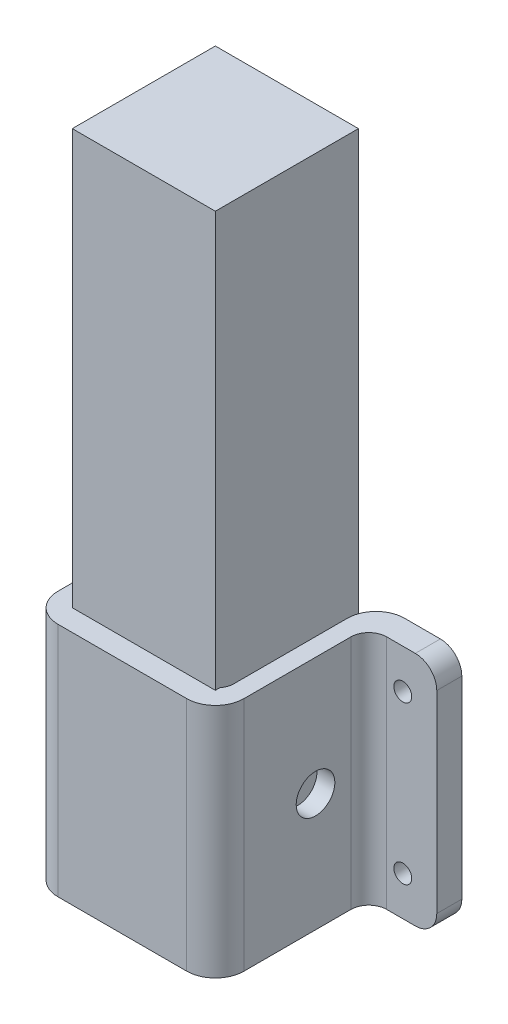
ISO-10303-21;
HEADER;
FILE_DESCRIPTION(('STEP AP214'),'2;1');
FILE_NAME('part.step','',(''),(''),'','','');
FILE_SCHEMA(('AUTOMOTIVE_DESIGN { 1 0 10303 214 1 1 1 1 }'));
ENDSEC;
DATA;
#1=APPLICATION_CONTEXT('core data for automotive mechanical design processes');
#2=APPLICATION_PROTOCOL_DEFINITION('international standard','automotive_design',2000,#1);
#3=PRODUCT_CONTEXT('',#1,'mechanical');
#4=PRODUCT('Part','Part','',(#3));
#5=PRODUCT_RELATED_PRODUCT_CATEGORY('part','',(#4));
#6=PRODUCT_DEFINITION_FORMATION('','',#4);
#7=PRODUCT_DEFINITION_CONTEXT('part definition',#1,'design');
#8=PRODUCT_DEFINITION('design','',#6,#7);
#9=PRODUCT_DEFINITION_SHAPE('','',#8);
#10=(LENGTH_UNIT() NAMED_UNIT(*) SI_UNIT(.MILLI.,.METRE.));
#11=(NAMED_UNIT(*) PLANE_ANGLE_UNIT() SI_UNIT($,.RADIAN.));
#12=(NAMED_UNIT(*) SI_UNIT($,.STERADIAN.) SOLID_ANGLE_UNIT());
#13=UNCERTAINTY_MEASURE_WITH_UNIT(LENGTH_MEASURE(1.E-05),#10,'distance_accuracy_value','');
#14=(GEOMETRIC_REPRESENTATION_CONTEXT(3) GLOBAL_UNCERTAINTY_ASSIGNED_CONTEXT((#13)) GLOBAL_UNIT_ASSIGNED_CONTEXT((#10,
#11,#12)) REPRESENTATION_CONTEXT('',''));
#15=CARTESIAN_POINT('',(0.,0.,0.));
#16=DIRECTION('',(0.,0.,1.));
#17=DIRECTION('',(1.,0.,0.));
#18=AXIS2_PLACEMENT_3D('',#15,#16,#17);
#19=CARTESIAN_POINT('',(0.,0.,-18.45));
#20=DIRECTION('',(0.,0.,1.));
#21=DIRECTION('',(1.,0.,0.));
#22=AXIS2_PLACEMENT_3D('',#19,#20,#21);
#23=PLANE('',#22);
#24=DIRECTION('',(0.,-1.,0.));
#25=VECTOR('',#24,1.);
#26=CARTESIAN_POINT('',(-12.5,33.,-18.45));
#27=LINE('',#26,#25);
#28=CARTESIAN_POINT('',(-12.5,30.,-18.45));
#29=VERTEX_POINT('',#28);
#30=CARTESIAN_POINT('',(-12.5,3.,-18.45));
#31=VERTEX_POINT('',#30);
#32=EDGE_CURVE('E347',#29,#31,#27,.T.);
#33=ORIENTED_EDGE('',*,*,#32,.T.);
#34=CARTESIAN_POINT('',(-9.5,3.,-18.45));
#35=DIRECTION('',(0.,0.,1.));
#36=DIRECTION('',(1.,0.,0.));
#37=AXIS2_PLACEMENT_3D('',#34,#35,#36);
#38=CIRCLE('',#37,3.);
#39=CARTESIAN_POINT('',(-9.5,0.,-18.45));
#40=VERTEX_POINT('',#39);
#41=EDGE_CURVE('E12',#31,#40,#38,.T.);
#42=ORIENTED_EDGE('',*,*,#41,.T.);
#43=DIRECTION('',(1.,0.,0.));
#44=VECTOR('',#43,1.);
#45=CARTESIAN_POINT('',(-12.5,0.,-18.45));
#46=LINE('',#45,#44);
#47=CARTESIAN_POINT('',(-5.5,0.,-18.45));
#48=VERTEX_POINT('',#47);
#49=EDGE_CURVE('E369',#40,#48,#46,.T.);
#50=ORIENTED_EDGE('',*,*,#49,.T.);
#51=DIRECTION('',(0.,-1.,0.));
#52=VECTOR('',#51,1.);
#53=CARTESIAN_POINT('',(-5.5,0.,-18.45));
#54=LINE('',#53,#52);
#55=CARTESIAN_POINT('',(-5.5,33.,-18.45));
#56=VERTEX_POINT('',#55);
#57=EDGE_CURVE('E236',#48,#56,#54,.F.);
#58=ORIENTED_EDGE('',*,*,#57,.T.);
#59=DIRECTION('',(-1.,0.,0.));
#60=VECTOR('',#59,1.);
#61=CARTESIAN_POINT('',(-0.5,33.,-18.45));
#62=LINE('',#61,#60);
#63=CARTESIAN_POINT('',(-9.5,33.,-18.45));
#64=VERTEX_POINT('',#63);
#65=EDGE_CURVE('E227',#56,#64,#62,.T.);
#66=ORIENTED_EDGE('',*,*,#65,.T.);
#67=CARTESIAN_POINT('',(-9.5,30.,-18.45));
#68=DIRECTION('',(0.,0.,1.));
#69=DIRECTION('',(1.,0.,0.));
#70=AXIS2_PLACEMENT_3D('',#67,#68,#69);
#71=CIRCLE('',#70,3.);
#72=EDGE_CURVE('E57',#64,#29,#71,.T.);
#73=ORIENTED_EDGE('',*,*,#72,.T.);
#74=EDGE_LOOP('',(#33,#42,#50,#58,#66,#73));
#75=FACE_BOUND('',#74,.T.);
#76=CARTESIAN_POINT('',(-7.74999999999999,5.5,-18.45));
#77=DIRECTION('',(0.,0.,-1.));
#78=DIRECTION('',(-1.,0.,0.));
#79=AXIS2_PLACEMENT_3D('',#76,#77,#78);
#80=CIRCLE('',#79,1.25);
#81=CARTESIAN_POINT('',(-8.99999999999999,5.5,-18.45));
#82=VERTEX_POINT('',#81);
#83=EDGE_CURVE('E782',#82,#82,#80,.F.);
#84=ORIENTED_EDGE('',*,*,#83,.F.);
#85=EDGE_LOOP('',(#84));
#86=FACE_BOUND('',#85,.T.);
#87=CARTESIAN_POINT('',(-7.75,27.5,-18.45));
#88=DIRECTION('',(0.,0.,-1.));
#89=DIRECTION('',(-1.,0.,0.));
#90=AXIS2_PLACEMENT_3D('',#87,#88,#89);
#91=CIRCLE('',#90,1.25);
#92=CARTESIAN_POINT('',(-9.,27.5,-18.45));
#93=VERTEX_POINT('',#92);
#94=EDGE_CURVE('E772',#93,#93,#91,.T.);
#95=ORIENTED_EDGE('',*,*,#94,.T.);
#96=EDGE_LOOP('',(#95));
#97=FACE_BOUND('',#96,.T.);
#98=ADVANCED_FACE('F49',(#75,#86,#97),#23,.T.);
#99=CARTESIAN_POINT('',(0.,0.,-21.95));
#100=DIRECTION('',(0.,0.,1.));
#101=DIRECTION('',(1.,0.,0.));
#102=AXIS2_PLACEMENT_3D('',#99,#100,#101);
#103=PLANE('',#102);
#104=CARTESIAN_POINT('',(-7.74999999999999,5.5,-21.95));
#105=DIRECTION('',(0.,0.,1.));
#106=DIRECTION('',(1.,0.,0.));
#107=AXIS2_PLACEMENT_3D('',#104,#105,#106);
#108=CIRCLE('',#107,1.25);
#109=CARTESIAN_POINT('',(-6.49999999999999,5.5,-21.95));
#110=VERTEX_POINT('',#109);
#111=EDGE_CURVE('E779',#110,#110,#108,.F.);
#112=ORIENTED_EDGE('',*,*,#111,.F.);
#113=EDGE_LOOP('',(#112));
#114=FACE_BOUND('',#113,.T.);
#115=DIRECTION('',(1.,0.,0.));
#116=VECTOR('',#115,1.);
#117=CARTESIAN_POINT('',(-12.5,0.,-21.95));
#118=LINE('',#117,#116);
#119=CARTESIAN_POINT('',(-9.5,0.,-21.95));
#120=VERTEX_POINT('',#119);
#121=CARTESIAN_POINT('',(-4.5,0.,-21.95));
#122=VERTEX_POINT('',#121);
#123=EDGE_CURVE('E355',#120,#122,#118,.T.);
#124=ORIENTED_EDGE('',*,*,#123,.F.);
#125=CARTESIAN_POINT('',(-9.5,3.,-21.95));
#126=DIRECTION('',(0.,0.,1.));
#127=DIRECTION('',(1.,0.,0.));
#128=AXIS2_PLACEMENT_3D('',#125,#126,#127);
#129=CIRCLE('',#128,3.);
#130=CARTESIAN_POINT('',(-12.5,3.,-21.95));
#131=VERTEX_POINT('',#130);
#132=EDGE_CURVE('E338',#120,#131,#129,.F.);
#133=ORIENTED_EDGE('',*,*,#132,.T.);
#134=DIRECTION('',(0.,-1.,0.));
#135=VECTOR('',#134,1.);
#136=CARTESIAN_POINT('',(-12.5,33.,-21.95));
#137=LINE('',#136,#135);
#138=CARTESIAN_POINT('',(-12.5,30.,-21.95));
#139=VERTEX_POINT('',#138);
#140=EDGE_CURVE('E346',#139,#131,#137,.T.);
#141=ORIENTED_EDGE('',*,*,#140,.F.);
#142=CARTESIAN_POINT('',(-9.5,30.,-21.95));
#143=DIRECTION('',(0.,0.,1.));
#144=DIRECTION('',(1.,0.,0.));
#145=AXIS2_PLACEMENT_3D('',#142,#143,#144);
#146=CIRCLE('',#145,3.);
#147=CARTESIAN_POINT('',(-9.5,33.,-21.95));
#148=VERTEX_POINT('',#147);
#149=EDGE_CURVE('E336',#139,#148,#146,.F.);
#150=ORIENTED_EDGE('',*,*,#149,.T.);
#151=DIRECTION('',(-1.,0.,0.));
#152=VECTOR('',#151,1.);
#153=CARTESIAN_POINT('',(-0.5,33.,-21.95));
#154=LINE('',#153,#152);
#155=CARTESIAN_POINT('',(-4.5,33.,-21.95));
#156=VERTEX_POINT('',#155);
#157=EDGE_CURVE('E358',#156,#148,#154,.T.);
#158=ORIENTED_EDGE('',*,*,#157,.F.);
#159=DIRECTION('',(0.,1.,0.));
#160=VECTOR('',#159,1.);
#161=CARTESIAN_POINT('',(-4.5,0.,-21.95));
#162=LINE('',#161,#160);
#163=EDGE_CURVE('E310',#156,#122,#162,.F.);
#164=ORIENTED_EDGE('',*,*,#163,.T.);
#165=EDGE_LOOP('',(#124,#133,#141,#150,#158,#164));
#166=FACE_BOUND('',#165,.T.);
#167=CARTESIAN_POINT('',(-7.75,27.5,-21.95));
#168=DIRECTION('',(0.,0.,1.));
#169=DIRECTION('',(1.,0.,0.));
#170=AXIS2_PLACEMENT_3D('',#167,#168,#169);
#171=CIRCLE('',#170,1.25);
#172=CARTESIAN_POINT('',(-6.5,27.5,-21.95));
#173=VERTEX_POINT('',#172);
#174=EDGE_CURVE('E774',#173,#173,#171,.T.);
#175=ORIENTED_EDGE('',*,*,#174,.T.);
#176=EDGE_LOOP('',(#175));
#177=FACE_BOUND('',#176,.T.);
#178=ADVANCED_FACE('F351',(#114,#166,#177),#103,.F.);
#179=CARTESIAN_POINT('',(0.,0.,-18.45));
#180=DIRECTION('',(0.,0.,-1.));
#181=DIRECTION('',(-1.,0.,0.));
#182=AXIS2_PLACEMENT_3D('',#179,#180,#181);
#183=PLANE('',#182);
#184=DIRECTION('',(1.,0.,0.));
#185=VECTOR('',#184,1.);
#186=CARTESIAN_POINT('',(32.5,0.,-18.45));
#187=LINE('',#186,#185);
#188=CARTESIAN_POINT('',(25.5,0.,-18.45));
#189=VERTEX_POINT('',#188);
#190=CARTESIAN_POINT('',(29.5,0.,-18.45));
#191=VERTEX_POINT('',#190);
#192=EDGE_CURVE('E380',#189,#191,#187,.T.);
#193=ORIENTED_EDGE('',*,*,#192,.T.);
#194=CARTESIAN_POINT('',(29.5,3.,-18.45));
#195=DIRECTION('',(0.,0.,-1.));
#196=DIRECTION('',(-1.,0.,0.));
#197=AXIS2_PLACEMENT_3D('',#194,#195,#196);
#198=CIRCLE('',#197,3.);
#199=CARTESIAN_POINT('',(32.5,3.,-18.45));
#200=VERTEX_POINT('',#199);
#201=EDGE_CURVE('E329',#191,#200,#198,.F.);
#202=ORIENTED_EDGE('',*,*,#201,.T.);
#203=DIRECTION('',(0.,1.,0.));
#204=VECTOR('',#203,1.);
#205=CARTESIAN_POINT('',(32.5,33.,-18.45));
#206=LINE('',#205,#204);
#207=CARTESIAN_POINT('',(32.5,30.,-18.45));
#208=VERTEX_POINT('',#207);
#209=EDGE_CURVE('E383',#200,#208,#206,.T.);
#210=ORIENTED_EDGE('',*,*,#209,.T.);
#211=CARTESIAN_POINT('',(29.5,30.,-18.45));
#212=DIRECTION('',(0.,0.,-1.));
#213=DIRECTION('',(-1.,0.,0.));
#214=AXIS2_PLACEMENT_3D('',#211,#212,#213);
#215=CIRCLE('',#214,3.);
#216=CARTESIAN_POINT('',(29.5,33.,-18.45));
#217=VERTEX_POINT('',#216);
#218=EDGE_CURVE('E327',#208,#217,#215,.F.);
#219=ORIENTED_EDGE('',*,*,#218,.T.);
#220=DIRECTION('',(-1.,0.,0.));
#221=VECTOR('',#220,1.);
#222=CARTESIAN_POINT('',(20.5,33.,-18.45));
#223=LINE('',#222,#221);
#224=CARTESIAN_POINT('',(25.5,33.,-18.45));
#225=VERTEX_POINT('',#224);
#226=EDGE_CURVE('E386',#217,#225,#223,.T.);
#227=ORIENTED_EDGE('',*,*,#226,.T.);
#228=DIRECTION('',(0.,1.,0.));
#229=VECTOR('',#228,1.);
#230=CARTESIAN_POINT('',(25.5,0.,-18.45));
#231=LINE('',#230,#229);
#232=EDGE_CURVE('E246',#225,#189,#231,.F.);
#233=ORIENTED_EDGE('',*,*,#232,.T.);
#234=EDGE_LOOP('',(#193,#202,#210,#219,#227,#233));
#235=FACE_BOUND('',#234,.T.);
#236=CARTESIAN_POINT('',(27.75,5.50000000000001,-18.45));
#237=DIRECTION('',(0.,0.,1.));
#238=DIRECTION('',(1.,0.,0.));
#239=AXIS2_PLACEMENT_3D('',#236,#237,#238);
#240=CIRCLE('',#239,1.25);
#241=CARTESIAN_POINT('',(29.,5.50000000000001,-18.45));
#242=VERTEX_POINT('',#241);
#243=EDGE_CURVE('E771',#242,#242,#240,.F.);
#244=ORIENTED_EDGE('',*,*,#243,.T.);
#245=EDGE_LOOP('',(#244));
#246=FACE_BOUND('',#245,.T.);
#247=CARTESIAN_POINT('',(27.75,27.5,-18.45));
#248=DIRECTION('',(0.,0.,1.));
#249=DIRECTION('',(1.,0.,0.));
#250=AXIS2_PLACEMENT_3D('',#247,#248,#249);
#251=CIRCLE('',#250,1.25);
#252=CARTESIAN_POINT('',(29.,27.5,-18.45));
#253=VERTEX_POINT('',#252);
#254=EDGE_CURVE('E356',#253,#253,#251,.T.);
#255=ORIENTED_EDGE('',*,*,#254,.F.);
#256=EDGE_LOOP('',(#255));
#257=FACE_BOUND('',#256,.T.);
#258=ADVANCED_FACE('F432',(#235,#246,#257),#183,.F.);
#259=CARTESIAN_POINT('',(0.,0.,-21.95));
#260=DIRECTION('',(0.,0.,-1.));
#261=DIRECTION('',(-1.,0.,0.));
#262=AXIS2_PLACEMENT_3D('',#259,#260,#261);
#263=PLANE('',#262);
#264=CARTESIAN_POINT('',(27.75,5.50000000000001,-21.95));
#265=DIRECTION('',(0.,0.,-1.));
#266=DIRECTION('',(-1.,0.,0.));
#267=AXIS2_PLACEMENT_3D('',#264,#265,#266);
#268=CIRCLE('',#267,1.25);
#269=CARTESIAN_POINT('',(26.5,5.50000000000001,-21.95));
#270=VERTEX_POINT('',#269);
#271=EDGE_CURVE('E364',#270,#270,#268,.T.);
#272=ORIENTED_EDGE('',*,*,#271,.F.);
#273=EDGE_LOOP('',(#272));
#274=FACE_BOUND('',#273,.T.);
#275=DIRECTION('',(0.,1.,0.));
#276=VECTOR('',#275,1.);
#277=CARTESIAN_POINT('',(32.5,33.,-21.95));
#278=LINE('',#277,#276);
#279=CARTESIAN_POINT('',(32.5,3.,-21.95));
#280=VERTEX_POINT('',#279);
#281=CARTESIAN_POINT('',(32.5,30.,-21.95));
#282=VERTEX_POINT('',#281);
#283=EDGE_CURVE('E375',#280,#282,#278,.T.);
#284=ORIENTED_EDGE('',*,*,#283,.F.);
#285=CARTESIAN_POINT('',(29.5,3.,-21.95));
#286=DIRECTION('',(0.,0.,-1.));
#287=DIRECTION('',(-1.,0.,0.));
#288=AXIS2_PLACEMENT_3D('',#285,#286,#287);
#289=CIRCLE('',#288,3.);
#290=CARTESIAN_POINT('',(29.5,0.,-21.95));
#291=VERTEX_POINT('',#290);
#292=EDGE_CURVE('E320',#280,#291,#289,.T.);
#293=ORIENTED_EDGE('',*,*,#292,.T.);
#294=DIRECTION('',(1.,0.,0.));
#295=VECTOR('',#294,1.);
#296=CARTESIAN_POINT('',(32.5,0.,-21.95));
#297=LINE('',#296,#295);
#298=CARTESIAN_POINT('',(24.5,0.,-21.95));
#299=VERTEX_POINT('',#298);
#300=EDGE_CURVE('E372',#299,#291,#297,.T.);
#301=ORIENTED_EDGE('',*,*,#300,.F.);
#302=DIRECTION('',(0.,-1.,0.));
#303=VECTOR('',#302,1.);
#304=CARTESIAN_POINT('',(24.5,0.,-21.95));
#305=LINE('',#304,#303);
#306=CARTESIAN_POINT('',(24.5,33.,-21.95));
#307=VERTEX_POINT('',#306);
#308=EDGE_CURVE('E300',#299,#307,#305,.F.);
#309=ORIENTED_EDGE('',*,*,#308,.T.);
#310=DIRECTION('',(-1.,0.,0.));
#311=VECTOR('',#310,1.);
#312=CARTESIAN_POINT('',(20.5,33.,-21.95));
#313=LINE('',#312,#311);
#314=CARTESIAN_POINT('',(29.5,33.,-21.95));
#315=VERTEX_POINT('',#314);
#316=EDGE_CURVE('E378',#315,#307,#313,.T.);
#317=ORIENTED_EDGE('',*,*,#316,.F.);
#318=CARTESIAN_POINT('',(29.5,30.,-21.95));
#319=DIRECTION('',(0.,0.,-1.));
#320=DIRECTION('',(-1.,0.,0.));
#321=AXIS2_PLACEMENT_3D('',#318,#319,#320);
#322=CIRCLE('',#321,3.);
#323=EDGE_CURVE('E318',#315,#282,#322,.T.);
#324=ORIENTED_EDGE('',*,*,#323,.T.);
#325=EDGE_LOOP('',(#284,#293,#301,#309,#317,#324));
#326=FACE_BOUND('',#325,.T.);
#327=CARTESIAN_POINT('',(27.75,27.5,-21.95));
#328=DIRECTION('',(0.,0.,-1.));
#329=DIRECTION('',(-1.,0.,0.));
#330=AXIS2_PLACEMENT_3D('',#327,#328,#329);
#331=CIRCLE('',#330,1.25);
#332=CARTESIAN_POINT('',(26.5,27.5,-21.95));
#333=VERTEX_POINT('',#332);
#334=EDGE_CURVE('E361',#333,#333,#331,.F.);
#335=ORIENTED_EDGE('',*,*,#334,.T.);
#336=EDGE_LOOP('',(#335));
#337=FACE_BOUND('',#336,.T.);
#338=ADVANCED_FACE('F423',(#274,#326,#337),#263,.T.);
#339=CARTESIAN_POINT('',(23.,33.,3.));
#340=DIRECTION('',(1.,0.,0.));
#341=DIRECTION('',(0.,1.,0.));
#342=AXIS2_PLACEMENT_3D('',#339,#340,#341);
#343=PLANE('',#342);
#344=CARTESIAN_POINT('',(23.,16.5,-11.));
#345=DIRECTION('',(-1.,0.,0.));
#346=DIRECTION('',(0.,-1.,0.));
#347=AXIS2_PLACEMENT_3D('',#344,#345,#346);
#348=CIRCLE('',#347,2.7);
#349=CARTESIAN_POINT('',(23.,13.8,-11.));
#350=VERTEX_POINT('',#349);
#351=EDGE_CURVE('E796',#350,#350,#348,.T.);
#352=ORIENTED_EDGE('',*,*,#351,.T.);
#353=EDGE_LOOP('',(#352));
#354=FACE_BOUND('',#353,.T.);
#355=DIRECTION('',(0.,0.,-1.));
#356=VECTOR('',#355,1.);
#357=CARTESIAN_POINT('',(23.,33.,3.));
#358=LINE('',#357,#356);
#359=CARTESIAN_POINT('',(23.,33.,-1.));
#360=VERTEX_POINT('',#359);
#361=CARTESIAN_POINT('',(23.,33.,-15.95));
#362=VERTEX_POINT('',#361);
#363=EDGE_CURVE('E241',#360,#362,#358,.T.);
#364=ORIENTED_EDGE('',*,*,#363,.F.);
#365=DIRECTION('',(0.,-1.,0.));
#366=VECTOR('',#365,1.);
#367=CARTESIAN_POINT('',(23.,0.,-1.));
#368=LINE('',#367,#366);
#369=CARTESIAN_POINT('',(23.,0.,-1.));
#370=VERTEX_POINT('',#369);
#371=EDGE_CURVE('E268',#360,#370,#368,.T.);
#372=ORIENTED_EDGE('',*,*,#371,.T.);
#373=DIRECTION('',(0.,0.,-1.));
#374=VECTOR('',#373,1.);
#375=CARTESIAN_POINT('',(23.,0.,3.));
#376=LINE('',#375,#374);
#377=CARTESIAN_POINT('',(23.,0.,-15.95));
#378=VERTEX_POINT('',#377);
#379=EDGE_CURVE('E408',#370,#378,#376,.T.);
#380=ORIENTED_EDGE('',*,*,#379,.T.);
#381=DIRECTION('',(0.,1.,0.));
#382=VECTOR('',#381,1.);
#383=CARTESIAN_POINT('',(23.,33.,-15.95));
#384=LINE('',#383,#382);
#385=EDGE_CURVE('E238',#378,#362,#384,.T.);
#386=ORIENTED_EDGE('',*,*,#385,.T.);
#387=EDGE_LOOP('',(#364,#372,#380,#386));
#388=FACE_BOUND('',#387,.T.);
#389=ADVANCED_FACE('F420',(#354,#388),#343,.T.);
#390=CARTESIAN_POINT('',(0.,0.,0.));
#391=DIRECTION('',(0.,0.,-1.));
#392=DIRECTION('',(-1.,0.,0.));
#393=AXIS2_PLACEMENT_3D('',#390,#391,#392);
#394=PLANE('',#393);
#395=DIRECTION('',(1.,0.,0.));
#396=VECTOR('',#395,1.);
#397=CARTESIAN_POINT('',(-3.,33.,0.));
#398=LINE('',#397,#396);
#399=CARTESIAN_POINT('',(1.5,33.,0.));
#400=VERTEX_POINT('',#399);
#401=CARTESIAN_POINT('',(18.5,33.,0.));
#402=VERTEX_POINT('',#401);
#403=EDGE_CURVE('E395',#400,#402,#398,.T.);
#404=ORIENTED_EDGE('',*,*,#403,.T.);
#405=DIRECTION('',(0.,-1.,0.));
#406=VECTOR('',#405,1.);
#407=CARTESIAN_POINT('',(18.5,0.,0.));
#408=LINE('',#407,#406);
#409=CARTESIAN_POINT('',(18.5,0.,0.));
#410=VERTEX_POINT('',#409);
#411=EDGE_CURVE('E274',#402,#410,#408,.T.);
#412=ORIENTED_EDGE('',*,*,#411,.T.);
#413=DIRECTION('',(-1.,0.,0.));
#414=VECTOR('',#413,1.);
#415=CARTESIAN_POINT('',(23.,0.,0.));
#416=LINE('',#415,#414);
#417=CARTESIAN_POINT('',(1.5,0.,0.));
#418=VERTEX_POINT('',#417);
#419=EDGE_CURVE('E401',#410,#418,#416,.T.);
#420=ORIENTED_EDGE('',*,*,#419,.T.);
#421=DIRECTION('',(0.,1.,0.));
#422=VECTOR('',#421,1.);
#423=CARTESIAN_POINT('',(1.5,33.,0.));
#424=LINE('',#423,#422);
#425=EDGE_CURVE('E271',#418,#400,#424,.T.);
#426=ORIENTED_EDGE('',*,*,#425,.T.);
#427=EDGE_LOOP('',(#404,#412,#420,#426));
#428=FACE_BOUND('',#427,.T.);
#429=ADVANCED_FACE('F422',(#428),#394,.T.);
#430=CARTESIAN_POINT('',(-3.,33.,3.));
#431=DIRECTION('',(0.,1.,0.));
#432=DIRECTION('',(0.,0.,1.));
#433=AXIS2_PLACEMENT_3D('',#430,#431,#432);
#434=PLANE('',#433);
#435=ORIENTED_EDGE('',*,*,#226,.F.);
#436=DIRECTION('',(0.,0.,-1.));
#437=VECTOR('',#436,1.);
#438=CARTESIAN_POINT('',(29.5,33.,-21.95));
#439=LINE('',#438,#437);
#440=EDGE_CURVE('E333',#217,#315,#439,.T.);
#441=ORIENTED_EDGE('',*,*,#440,.T.);
#442=ORIENTED_EDGE('',*,*,#316,.T.);
#443=CARTESIAN_POINT('',(24.5,33.,-17.95));
#444=DIRECTION('',(0.,1.,0.));
#445=DIRECTION('',(0.,0.,1.));
#446=AXIS2_PLACEMENT_3D('',#443,#444,#445);
#447=CIRCLE('',#446,4.);
#448=CARTESIAN_POINT('',(20.5,33.,-17.95));
#449=VERTEX_POINT('',#448);
#450=EDGE_CURVE('E305',#307,#449,#447,.T.);
#451=ORIENTED_EDGE('',*,*,#450,.T.);
#452=DIRECTION('',(0.,0.,1.));
#453=VECTOR('',#452,1.);
#454=CARTESIAN_POINT('',(20.5,33.,-20.2));
#455=LINE('',#454,#453);
#456=CARTESIAN_POINT('',(20.5,33.,-2.));
#457=VERTEX_POINT('',#456);
#458=EDGE_CURVE('E391',#449,#457,#455,.T.);
#459=ORIENTED_EDGE('',*,*,#458,.T.);
#460=CARTESIAN_POINT('',(18.5,33.,-2.));
#461=DIRECTION('',(0.,1.,0.));
#462=DIRECTION('',(0.,0.,1.));
#463=AXIS2_PLACEMENT_3D('',#460,#461,#462);
#464=CIRCLE('',#463,2.);
#465=EDGE_CURVE('E286',#457,#402,#464,.F.);
#466=ORIENTED_EDGE('',*,*,#465,.T.);
#467=ORIENTED_EDGE('',*,*,#403,.F.);
#468=CARTESIAN_POINT('',(1.5,33.,-2.));
#469=DIRECTION('',(0.,1.,0.));
#470=DIRECTION('',(0.,0.,1.));
#471=AXIS2_PLACEMENT_3D('',#468,#469,#470);
#472=CIRCLE('',#471,2.);
#473=CARTESIAN_POINT('',(-0.5,33.,-2.));
#474=VERTEX_POINT('',#473);
#475=EDGE_CURVE('E288',#400,#474,#472,.F.);
#476=ORIENTED_EDGE('',*,*,#475,.T.);
#477=DIRECTION('',(0.,0.,1.));
#478=VECTOR('',#477,1.);
#479=CARTESIAN_POINT('',(-0.5,33.,-20.2));
#480=LINE('',#479,#478);
#481=CARTESIAN_POINT('',(-0.5,33.,-17.95));
#482=VERTEX_POINT('',#481);
#483=EDGE_CURVE('E389',#482,#474,#480,.T.);
#484=ORIENTED_EDGE('',*,*,#483,.F.);
#485=CARTESIAN_POINT('',(-4.5,33.,-17.95));
#486=DIRECTION('',(0.,1.,0.));
#487=DIRECTION('',(0.,0.,1.));
#488=AXIS2_PLACEMENT_3D('',#485,#486,#487);
#489=CIRCLE('',#488,4.);
#490=EDGE_CURVE('E303',#482,#156,#489,.T.);
#491=ORIENTED_EDGE('',*,*,#490,.T.);
#492=ORIENTED_EDGE('',*,*,#157,.T.);
#493=DIRECTION('',(0.,0.,-1.));
#494=VECTOR('',#493,1.);
#495=CARTESIAN_POINT('',(-9.5,33.,-18.45));
#496=LINE('',#495,#494);
#497=EDGE_CURVE('E331',#148,#64,#496,.F.);
#498=ORIENTED_EDGE('',*,*,#497,.T.);
#499=ORIENTED_EDGE('',*,*,#65,.F.);
#500=CARTESIAN_POINT('',(-5.5,33.,-15.95));
#501=DIRECTION('',(0.,1.,0.));
#502=DIRECTION('',(0.,0.,1.));
#503=AXIS2_PLACEMENT_3D('',#500,#501,#502);
#504=CIRCLE('',#503,2.5);
#505=CARTESIAN_POINT('',(-3.,33.,-15.95));
#506=VERTEX_POINT('',#505);
#507=EDGE_CURVE('E224',#56,#506,#504,.F.);
#508=ORIENTED_EDGE('',*,*,#507,.T.);
#509=DIRECTION('',(0.,0.,-1.));
#510=VECTOR('',#509,1.);
#511=CARTESIAN_POINT('',(-3.,33.,3.));
#512=LINE('',#511,#510);
#513=CARTESIAN_POINT('',(-3.,33.,-1.));
#514=VERTEX_POINT('',#513);
#515=EDGE_CURVE('E210',#514,#506,#512,.T.);
#516=ORIENTED_EDGE('',*,*,#515,.F.);
#517=CARTESIAN_POINT('',(1.,33.,-1.));
#518=DIRECTION('',(0.,1.,0.));
#519=DIRECTION('',(0.,0.,1.));
#520=AXIS2_PLACEMENT_3D('',#517,#518,#519);
#521=CIRCLE('',#520,4.);
#522=CARTESIAN_POINT('',(0.999999999999999,33.,3.));
#523=VERTEX_POINT('',#522);
#524=EDGE_CURVE('E266',#514,#523,#521,.T.);
#525=ORIENTED_EDGE('',*,*,#524,.T.);
#526=DIRECTION('',(1.,0.,0.));
#527=VECTOR('',#526,1.);
#528=CARTESIAN_POINT('',(-3.,33.,3.));
#529=LINE('',#528,#527);
#530=CARTESIAN_POINT('',(19.,33.,3.));
#531=VERTEX_POINT('',#530);
#532=EDGE_CURVE('E397',#523,#531,#529,.T.);
#533=ORIENTED_EDGE('',*,*,#532,.T.);
#534=CARTESIAN_POINT('',(19.,33.,-1.));
#535=DIRECTION('',(0.,1.,0.));
#536=DIRECTION('',(0.,0.,1.));
#537=AXIS2_PLACEMENT_3D('',#534,#535,#536);
#538=CIRCLE('',#537,4.);
#539=EDGE_CURVE('E264',#531,#360,#538,.T.);
#540=ORIENTED_EDGE('',*,*,#539,.T.);
#541=ORIENTED_EDGE('',*,*,#363,.T.);
#542=CARTESIAN_POINT('',(25.5,33.,-15.95));
#543=DIRECTION('',(0.,1.,0.));
#544=DIRECTION('',(0.,0.,1.));
#545=AXIS2_PLACEMENT_3D('',#542,#543,#544);
#546=CIRCLE('',#545,2.5);
#547=EDGE_CURVE('E230',#362,#225,#546,.F.);
#548=ORIENTED_EDGE('',*,*,#547,.T.);
#549=EDGE_LOOP('',(#435,#441,#442,#451,#459,#466,#467,#476,#484,#491,#492,#498,#499,#508,#516,
#525,#533,#540,#541,#548));
#550=FACE_BOUND('',#549,.T.);
#551=ADVANCED_FACE('F226',(#550),#434,.T.);
#552=CARTESIAN_POINT('',(-3.,33.,3.));
#553=DIRECTION('',(1.,0.,0.));
#554=DIRECTION('',(0.,1.,0.));
#555=AXIS2_PLACEMENT_3D('',#552,#553,#554);
#556=PLANE('',#555);
#557=CARTESIAN_POINT('',(-3.,16.5,-11.));
#558=DIRECTION('',(-1.,0.,0.));
#559=DIRECTION('',(0.,-1.,0.));
#560=AXIS2_PLACEMENT_3D('',#557,#558,#559);
#561=CIRCLE('',#560,2.7);
#562=CARTESIAN_POINT('',(-3.,13.8,-11.));
#563=VERTEX_POINT('',#562);
#564=EDGE_CURVE('E785',#563,#563,#561,.T.);
#565=ORIENTED_EDGE('',*,*,#564,.F.);
#566=EDGE_LOOP('',(#565));
#567=FACE_BOUND('',#566,.T.);
#568=DIRECTION('',(0.,0.,-1.));
#569=VECTOR('',#568,1.);
#570=CARTESIAN_POINT('',(-3.,0.,3.));
#571=LINE('',#570,#569);
#572=CARTESIAN_POINT('',(-3.,0.,-1.));
#573=VERTEX_POINT('',#572);
#574=CARTESIAN_POINT('',(-3.,0.,-15.95));
#575=VERTEX_POINT('',#574);
#576=EDGE_CURVE('E220',#573,#575,#571,.T.);
#577=ORIENTED_EDGE('',*,*,#576,.F.);
#578=DIRECTION('',(0.,-1.,0.));
#579=VECTOR('',#578,1.);
#580=CARTESIAN_POINT('',(-3.,33.,-1.));
#581=LINE('',#580,#579);
#582=EDGE_CURVE('E217',#573,#514,#581,.F.);
#583=ORIENTED_EDGE('',*,*,#582,.T.);
#584=ORIENTED_EDGE('',*,*,#515,.T.);
#585=DIRECTION('',(0.,-1.,0.));
#586=VECTOR('',#585,1.);
#587=CARTESIAN_POINT('',(-3.,33.,-15.95));
#588=LINE('',#587,#586);
#589=EDGE_CURVE('E215',#506,#575,#588,.T.);
#590=ORIENTED_EDGE('',*,*,#589,.T.);
#591=EDGE_LOOP('',(#577,#583,#584,#590));
#592=FACE_BOUND('',#591,.T.);
#593=ADVANCED_FACE('F213',(#567,#592),#556,.F.);
#594=CARTESIAN_POINT('',(23.,0.,3.));
#595=DIRECTION('',(0.,-1.,0.));
#596=DIRECTION('',(0.,0.,-1.));
#597=AXIS2_PLACEMENT_3D('',#594,#595,#596);
#598=PLANE('',#597);
#599=ORIENTED_EDGE('',*,*,#300,.T.);
#600=DIRECTION('',(0.,0.,-1.));
#601=VECTOR('',#600,1.);
#602=CARTESIAN_POINT('',(29.5,0.,-18.45));
#603=LINE('',#602,#601);
#604=EDGE_CURVE('E325',#291,#191,#603,.F.);
#605=ORIENTED_EDGE('',*,*,#604,.T.);
#606=ORIENTED_EDGE('',*,*,#192,.F.);
#607=CARTESIAN_POINT('',(25.5,0.,-15.95));
#608=DIRECTION('',(0.,-1.,0.));
#609=DIRECTION('',(0.,0.,-1.));
#610=AXIS2_PLACEMENT_3D('',#607,#608,#609);
#611=CIRCLE('',#610,2.5);
#612=EDGE_CURVE('E251',#189,#378,#611,.F.);
#613=ORIENTED_EDGE('',*,*,#612,.T.);
#614=ORIENTED_EDGE('',*,*,#379,.F.);
#615=CARTESIAN_POINT('',(19.,0.,-1.));
#616=DIRECTION('',(0.,-1.,0.));
#617=DIRECTION('',(0.,0.,-1.));
#618=AXIS2_PLACEMENT_3D('',#615,#616,#617);
#619=CIRCLE('',#618,4.);
#620=CARTESIAN_POINT('',(19.,0.,3.));
#621=VERTEX_POINT('',#620);
#622=EDGE_CURVE('E259',#370,#621,#619,.T.);
#623=ORIENTED_EDGE('',*,*,#622,.T.);
#624=DIRECTION('',(-1.,0.,0.));
#625=VECTOR('',#624,1.);
#626=CARTESIAN_POINT('',(23.,0.,3.));
#627=LINE('',#626,#625);
#628=CARTESIAN_POINT('',(0.999999999999997,0.,3.));
#629=VERTEX_POINT('',#628);
#630=EDGE_CURVE('E400',#621,#629,#627,.T.);
#631=ORIENTED_EDGE('',*,*,#630,.T.);
#632=CARTESIAN_POINT('',(0.999999999999997,0.,-1.));
#633=DIRECTION('',(0.,-1.,0.));
#634=DIRECTION('',(0.,0.,-1.));
#635=AXIS2_PLACEMENT_3D('',#632,#633,#634);
#636=CIRCLE('',#635,4.);
#637=EDGE_CURVE('E261',#629,#573,#636,.T.);
#638=ORIENTED_EDGE('',*,*,#637,.T.);
#639=ORIENTED_EDGE('',*,*,#576,.T.);
#640=CARTESIAN_POINT('',(-5.5,0.,-15.95));
#641=DIRECTION('',(0.,-1.,0.));
#642=DIRECTION('',(0.,0.,-1.));
#643=AXIS2_PLACEMENT_3D('',#640,#641,#642);
#644=CIRCLE('',#643,2.5);
#645=EDGE_CURVE('E231',#575,#48,#644,.F.);
#646=ORIENTED_EDGE('',*,*,#645,.T.);
#647=ORIENTED_EDGE('',*,*,#49,.F.);
#648=DIRECTION('',(0.,0.,-1.));
#649=VECTOR('',#648,1.);
#650=CARTESIAN_POINT('',(-9.5,0.,-21.95));
#651=LINE('',#650,#649);
#652=EDGE_CURVE('E322',#40,#120,#651,.T.);
#653=ORIENTED_EDGE('',*,*,#652,.T.);
#654=ORIENTED_EDGE('',*,*,#123,.T.);
#655=CARTESIAN_POINT('',(-4.5,0.,-17.95));
#656=DIRECTION('',(0.,-1.,0.));
#657=DIRECTION('',(0.,0.,-1.));
#658=AXIS2_PLACEMENT_3D('',#655,#656,#657);
#659=CIRCLE('',#658,4.);
#660=CARTESIAN_POINT('',(-0.5,0.,-17.95));
#661=VERTEX_POINT('',#660);
#662=EDGE_CURVE('E296',#122,#661,#659,.T.);
#663=ORIENTED_EDGE('',*,*,#662,.T.);
#664=DIRECTION('',(0.,0.,1.));
#665=VECTOR('',#664,1.);
#666=CARTESIAN_POINT('',(-0.5,0.,-20.2));
#667=LINE('',#666,#665);
#668=CARTESIAN_POINT('',(-0.5,0.,-2.));
#669=VERTEX_POINT('',#668);
#670=EDGE_CURVE('E388',#661,#669,#667,.T.);
#671=ORIENTED_EDGE('',*,*,#670,.T.);
#672=CARTESIAN_POINT('',(1.5,0.,-2.));
#673=DIRECTION('',(0.,-1.,0.));
#674=DIRECTION('',(0.,0.,-1.));
#675=AXIS2_PLACEMENT_3D('',#672,#673,#674);
#676=CIRCLE('',#675,2.);
#677=EDGE_CURVE('E291',#669,#418,#676,.F.);
#678=ORIENTED_EDGE('',*,*,#677,.T.);
#679=ORIENTED_EDGE('',*,*,#419,.F.);
#680=CARTESIAN_POINT('',(18.5,0.,-2.));
#681=DIRECTION('',(0.,-1.,0.));
#682=DIRECTION('',(0.,0.,-1.));
#683=AXIS2_PLACEMENT_3D('',#680,#681,#682);
#684=CIRCLE('',#683,2.);
#685=CARTESIAN_POINT('',(20.5,0.,-2.));
#686=VERTEX_POINT('',#685);
#687=EDGE_CURVE('E283',#410,#686,#684,.F.);
#688=ORIENTED_EDGE('',*,*,#687,.T.);
#689=DIRECTION('',(0.,0.,1.));
#690=VECTOR('',#689,1.);
#691=CARTESIAN_POINT('',(20.5,0.,-20.2));
#692=LINE('',#691,#690);
#693=CARTESIAN_POINT('',(20.5,0.,-17.95));
#694=VERTEX_POINT('',#693);
#695=EDGE_CURVE('E393',#694,#686,#692,.T.);
#696=ORIENTED_EDGE('',*,*,#695,.F.);
#697=CARTESIAN_POINT('',(24.5,0.,-17.95));
#698=DIRECTION('',(0.,-1.,0.));
#699=DIRECTION('',(0.,0.,-1.));
#700=AXIS2_PLACEMENT_3D('',#697,#698,#699);
#701=CIRCLE('',#700,4.);
#702=EDGE_CURVE('E298',#694,#299,#701,.T.);
#703=ORIENTED_EDGE('',*,*,#702,.T.);
#704=EDGE_LOOP('',(#599,#605,#606,#613,#614,#623,#631,#638,#639,#646,#647,#653,#654,#663,#671,
#678,#679,#688,#696,#703));
#705=FACE_BOUND('',#704,.T.);
#706=ADVANCED_FACE('F468',(#705),#598,.T.);
#707=CARTESIAN_POINT('',(0.,0.,3.));
#708=DIRECTION('',(0.,0.,-1.));
#709=DIRECTION('',(-1.,0.,0.));
#710=AXIS2_PLACEMENT_3D('',#707,#708,#709);
#711=PLANE('',#710);
#712=ORIENTED_EDGE('',*,*,#532,.F.);
#713=DIRECTION('',(0.,-1.,0.));
#714=VECTOR('',#713,1.);
#715=CARTESIAN_POINT('',(0.999999999999997,0.,3.));
#716=LINE('',#715,#714);
#717=EDGE_CURVE('E256',#523,#629,#716,.T.);
#718=ORIENTED_EDGE('',*,*,#717,.T.);
#719=ORIENTED_EDGE('',*,*,#630,.F.);
#720=DIRECTION('',(0.,-1.,0.));
#721=VECTOR('',#720,1.);
#722=CARTESIAN_POINT('',(19.,33.,3.));
#723=LINE('',#722,#721);
#724=EDGE_CURVE('E254',#621,#531,#723,.F.);
#725=ORIENTED_EDGE('',*,*,#724,.T.);
#726=EDGE_LOOP('',(#712,#718,#719,#725));
#727=FACE_BOUND('',#726,.T.);
#728=ADVANCED_FACE('F465',(#727),#711,.F.);
#729=CARTESIAN_POINT('',(20.5,33.,-20.2));
#730=DIRECTION('',(-1.,0.,0.));
#731=DIRECTION('',(0.,0.,1.));
#732=AXIS2_PLACEMENT_3D('',#729,#730,#731);
#733=PLANE('',#732);
#734=CARTESIAN_POINT('',(20.5,16.5,-11.));
#735=DIRECTION('',(-1.,0.,0.));
#736=DIRECTION('',(0.,0.,1.));
#737=AXIS2_PLACEMENT_3D('',#734,#735,#736);
#738=CIRCLE('',#737,2.7);
#739=CARTESIAN_POINT('',(20.5,16.5,-8.3));
#740=VERTEX_POINT('',#739);
#741=EDGE_CURVE('E791',#740,#740,#738,.T.);
#742=ORIENTED_EDGE('',*,*,#741,.F.);
#743=EDGE_LOOP('',(#742));
#744=FACE_BOUND('',#743,.T.);
#745=ORIENTED_EDGE('',*,*,#458,.F.);
#746=DIRECTION('',(0.,-1.,0.));
#747=VECTOR('',#746,1.);
#748=CARTESIAN_POINT('',(20.5,33.,-17.95));
#749=LINE('',#748,#747);
#750=EDGE_CURVE('E293',#449,#694,#749,.T.);
#751=ORIENTED_EDGE('',*,*,#750,.T.);
#752=ORIENTED_EDGE('',*,*,#695,.T.);
#753=DIRECTION('',(0.,-1.,0.));
#754=VECTOR('',#753,1.);
#755=CARTESIAN_POINT('',(20.5,33.,-2.));
#756=LINE('',#755,#754);
#757=EDGE_CURVE('E277',#686,#457,#756,.F.);
#758=ORIENTED_EDGE('',*,*,#757,.T.);
#759=EDGE_LOOP('',(#745,#751,#752,#758));
#760=FACE_BOUND('',#759,.T.);
#761=ADVANCED_FACE('F461',(#744,#760),#733,.T.);
#762=CARTESIAN_POINT('',(-0.5,33.,-20.2));
#763=DIRECTION('',(1.,0.,0.));
#764=DIRECTION('',(0.,0.,-1.));
#765=AXIS2_PLACEMENT_3D('',#762,#763,#764);
#766=PLANE('',#765);
#767=CARTESIAN_POINT('',(-0.5,16.5,-11.));
#768=DIRECTION('',(1.,0.,0.));
#769=DIRECTION('',(0.,0.,-1.));
#770=AXIS2_PLACEMENT_3D('',#767,#768,#769);
#771=CIRCLE('',#770,2.7);
#772=CARTESIAN_POINT('',(-0.5,16.5,-13.7));
#773=VERTEX_POINT('',#772);
#774=EDGE_CURVE('E788',#773,#773,#771,.F.);
#775=ORIENTED_EDGE('',*,*,#774,.T.);
#776=EDGE_LOOP('',(#775));
#777=FACE_BOUND('',#776,.T.);
#778=ORIENTED_EDGE('',*,*,#670,.F.);
#779=DIRECTION('',(0.,1.,0.));
#780=VECTOR('',#779,1.);
#781=CARTESIAN_POINT('',(-0.5,33.,-17.95));
#782=LINE('',#781,#780);
#783=EDGE_CURVE('E307',#661,#482,#782,.T.);
#784=ORIENTED_EDGE('',*,*,#783,.T.);
#785=ORIENTED_EDGE('',*,*,#483,.T.);
#786=DIRECTION('',(0.,1.,0.));
#787=VECTOR('',#786,1.);
#788=CARTESIAN_POINT('',(-0.5,0.,-2.));
#789=LINE('',#788,#787);
#790=EDGE_CURVE('E280',#474,#669,#789,.F.);
#791=ORIENTED_EDGE('',*,*,#790,.T.);
#792=EDGE_LOOP('',(#778,#784,#785,#791));
#793=FACE_BOUND('',#792,.T.);
#794=ADVANCED_FACE('F457',(#777,#793),#766,.T.);
#795=CARTESIAN_POINT('',(32.5,33.,-18.45));
#796=DIRECTION('',(-1.,0.,0.));
#797=DIRECTION('',(0.,0.,1.));
#798=AXIS2_PLACEMENT_3D('',#795,#796,#797);
#799=PLANE('',#798);
#800=ORIENTED_EDGE('',*,*,#209,.F.);
#801=DIRECTION('',(0.,0.,-1.));
#802=VECTOR('',#801,1.);
#803=CARTESIAN_POINT('',(32.5,3.,-21.95));
#804=LINE('',#803,#802);
#805=EDGE_CURVE('E315',#200,#280,#804,.T.);
#806=ORIENTED_EDGE('',*,*,#805,.T.);
#807=ORIENTED_EDGE('',*,*,#283,.T.);
#808=DIRECTION('',(0.,0.,-1.));
#809=VECTOR('',#808,1.);
#810=CARTESIAN_POINT('',(32.5,30.,-18.45));
#811=LINE('',#810,#809);
#812=EDGE_CURVE('E313',#282,#208,#811,.F.);
#813=ORIENTED_EDGE('',*,*,#812,.T.);
#814=EDGE_LOOP('',(#800,#806,#807,#813));
#815=FACE_BOUND('',#814,.T.);
#816=ADVANCED_FACE('F450',(#815),#799,.F.);
#817=CARTESIAN_POINT('',(-12.5,33.,-18.45));
#818=DIRECTION('',(1.,0.,0.));
#819=DIRECTION('',(0.,0.,-1.));
#820=AXIS2_PLACEMENT_3D('',#817,#818,#819);
#821=PLANE('',#820);
#822=ORIENTED_EDGE('',*,*,#140,.T.);
#823=DIRECTION('',(0.,0.,-1.));
#824=VECTOR('',#823,1.);
#825=CARTESIAN_POINT('',(-12.5,3.,-18.45));
#826=LINE('',#825,#824);
#827=EDGE_CURVE('E64',#131,#31,#826,.F.);
#828=ORIENTED_EDGE('',*,*,#827,.T.);
#829=ORIENTED_EDGE('',*,*,#32,.F.);
#830=DIRECTION('',(0.,0.,-1.));
#831=VECTOR('',#830,1.);
#832=CARTESIAN_POINT('',(-12.5,30.,-21.95));
#833=LINE('',#832,#831);
#834=EDGE_CURVE('E340',#29,#139,#833,.T.);
#835=ORIENTED_EDGE('',*,*,#834,.T.);
#836=EDGE_LOOP('',(#822,#828,#829,#835));
#837=FACE_BOUND('',#836,.T.);
#838=ADVANCED_FACE('F345',(#837),#821,.F.);
#839=CARTESIAN_POINT('',(27.75,5.50000000000001,-21.951));
#840=DIRECTION('',(0.,0.,1.));
#841=DIRECTION('',(1.,0.,0.));
#842=AXIS2_PLACEMENT_3D('',#839,#840,#841);
#843=CYLINDRICAL_SURFACE('',#842,1.25);
#844=ORIENTED_EDGE('',*,*,#271,.T.);
#845=EDGE_LOOP('',(#844));
#846=FACE_BOUND('',#845,.T.);
#847=ORIENTED_EDGE('',*,*,#243,.F.);
#848=EDGE_LOOP('',(#847));
#849=FACE_BOUND('',#848,.T.);
#850=ADVANCED_FACE('F449',(#846,#849),#843,.F.);
#851=CARTESIAN_POINT('',(27.75,27.5,-21.951));
#852=DIRECTION('',(0.,0.,1.));
#853=DIRECTION('',(1.,0.,0.));
#854=AXIS2_PLACEMENT_3D('',#851,#852,#853);
#855=CYLINDRICAL_SURFACE('',#854,1.25);
#856=ORIENTED_EDGE('',*,*,#334,.F.);
#857=EDGE_LOOP('',(#856));
#858=FACE_BOUND('',#857,.T.);
#859=ORIENTED_EDGE('',*,*,#254,.T.);
#860=EDGE_LOOP('',(#859));
#861=FACE_BOUND('',#860,.T.);
#862=ADVANCED_FACE('F747',(#858,#861),#855,.F.);
#863=CARTESIAN_POINT('',(-7.74999999999999,5.5,-21.951));
#864=DIRECTION('',(0.,0.,1.));
#865=DIRECTION('',(1.,0.,0.));
#866=AXIS2_PLACEMENT_3D('',#863,#864,#865);
#867=CYLINDRICAL_SURFACE('',#866,1.25);
#868=ORIENTED_EDGE('',*,*,#83,.T.);
#869=EDGE_LOOP('',(#868));
#870=FACE_BOUND('',#869,.T.);
#871=ORIENTED_EDGE('',*,*,#111,.T.);
#872=EDGE_LOOP('',(#871));
#873=FACE_BOUND('',#872,.T.);
#874=ADVANCED_FACE('F739',(#870,#873),#867,.F.);
#875=CARTESIAN_POINT('',(-7.75,27.5,-21.951));
#876=DIRECTION('',(0.,0.,1.));
#877=DIRECTION('',(1.,0.,0.));
#878=AXIS2_PLACEMENT_3D('',#875,#876,#877);
#879=CYLINDRICAL_SURFACE('',#878,1.25);
#880=ORIENTED_EDGE('',*,*,#94,.F.);
#881=EDGE_LOOP('',(#880));
#882=FACE_BOUND('',#881,.T.);
#883=ORIENTED_EDGE('',*,*,#174,.F.);
#884=EDGE_LOOP('',(#883));
#885=FACE_BOUND('',#884,.T.);
#886=ADVANCED_FACE('F559',(#882,#885),#879,.F.);
#887=CARTESIAN_POINT('',(-5.5,33.,-15.95));
#888=DIRECTION('',(0.,-1.,0.));
#889=DIRECTION('',(1.,0.,0.));
#890=AXIS2_PLACEMENT_3D('',#887,#888,#889);
#891=CYLINDRICAL_SURFACE('',#890,2.5);
#892=ORIENTED_EDGE('',*,*,#507,.F.);
#893=ORIENTED_EDGE('',*,*,#57,.F.);
#894=ORIENTED_EDGE('',*,*,#645,.F.);
#895=ORIENTED_EDGE('',*,*,#589,.F.);
#896=EDGE_LOOP('',(#892,#893,#894,#895));
#897=FACE_BOUND('',#896,.T.);
#898=ADVANCED_FACE('F234',(#897),#891,.F.);
#899=CARTESIAN_POINT('',(25.5,33.,-15.95));
#900=DIRECTION('',(0.,1.,0.));
#901=DIRECTION('',(-1.,0.,0.));
#902=AXIS2_PLACEMENT_3D('',#899,#900,#901);
#903=CYLINDRICAL_SURFACE('',#902,2.5);
#904=ORIENTED_EDGE('',*,*,#612,.F.);
#905=ORIENTED_EDGE('',*,*,#232,.F.);
#906=ORIENTED_EDGE('',*,*,#547,.F.);
#907=ORIENTED_EDGE('',*,*,#385,.F.);
#908=EDGE_LOOP('',(#904,#905,#906,#907));
#909=FACE_BOUND('',#908,.T.);
#910=ADVANCED_FACE('F419',(#909),#903,.F.);
#911=CARTESIAN_POINT('',(0.999999999999997,0.,-1.));
#912=DIRECTION('',(0.,-1.,0.));
#913=DIRECTION('',(1.,0.,0.));
#914=AXIS2_PLACEMENT_3D('',#911,#912,#913);
#915=CYLINDRICAL_SURFACE('',#914,4.);
#916=ORIENTED_EDGE('',*,*,#524,.F.);
#917=ORIENTED_EDGE('',*,*,#582,.F.);
#918=ORIENTED_EDGE('',*,*,#637,.F.);
#919=ORIENTED_EDGE('',*,*,#717,.F.);
#920=EDGE_LOOP('',(#916,#917,#918,#919));
#921=FACE_BOUND('',#920,.T.);
#922=ADVANCED_FACE('F551',(#921),#915,.T.);
#923=CARTESIAN_POINT('',(19.,33.,-1.));
#924=DIRECTION('',(0.,1.,0.));
#925=DIRECTION('',(-1.,0.,0.));
#926=AXIS2_PLACEMENT_3D('',#923,#924,#925);
#927=CYLINDRICAL_SURFACE('',#926,4.);
#928=ORIENTED_EDGE('',*,*,#539,.F.);
#929=ORIENTED_EDGE('',*,*,#724,.F.);
#930=ORIENTED_EDGE('',*,*,#622,.F.);
#931=ORIENTED_EDGE('',*,*,#371,.F.);
#932=EDGE_LOOP('',(#928,#929,#930,#931));
#933=FACE_BOUND('',#932,.T.);
#934=ADVANCED_FACE('F548',(#933),#927,.T.);
#935=CARTESIAN_POINT('',(18.5,0.,-2.));
#936=DIRECTION('',(0.,1.,0.));
#937=DIRECTION('',(0.,0.,1.));
#938=AXIS2_PLACEMENT_3D('',#935,#936,#937);
#939=CYLINDRICAL_SURFACE('',#938,2.);
#940=ORIENTED_EDGE('',*,*,#465,.F.);
#941=ORIENTED_EDGE('',*,*,#757,.F.);
#942=ORIENTED_EDGE('',*,*,#687,.F.);
#943=ORIENTED_EDGE('',*,*,#411,.F.);
#944=EDGE_LOOP('',(#940,#941,#942,#943));
#945=FACE_BOUND('',#944,.T.);
#946=ADVANCED_FACE('F507',(#945),#939,.F.);
#947=CARTESIAN_POINT('',(1.5,0.,-2.));
#948=DIRECTION('',(0.,-1.,0.));
#949=DIRECTION('',(0.,0.,-1.));
#950=AXIS2_PLACEMENT_3D('',#947,#948,#949);
#951=CYLINDRICAL_SURFACE('',#950,2.);
#952=ORIENTED_EDGE('',*,*,#677,.F.);
#953=ORIENTED_EDGE('',*,*,#790,.F.);
#954=ORIENTED_EDGE('',*,*,#475,.F.);
#955=ORIENTED_EDGE('',*,*,#425,.F.);
#956=EDGE_LOOP('',(#952,#953,#954,#955));
#957=FACE_BOUND('',#956,.T.);
#958=ADVANCED_FACE('F513',(#957),#951,.F.);
#959=CARTESIAN_POINT('',(24.5,33.,-17.95));
#960=DIRECTION('',(0.,-1.,0.));
#961=DIRECTION('',(0.,0.,-1.));
#962=AXIS2_PLACEMENT_3D('',#959,#960,#961);
#963=CYLINDRICAL_SURFACE('',#962,4.);
#964=ORIENTED_EDGE('',*,*,#450,.F.);
#965=ORIENTED_EDGE('',*,*,#308,.F.);
#966=ORIENTED_EDGE('',*,*,#702,.F.);
#967=ORIENTED_EDGE('',*,*,#750,.F.);
#968=EDGE_LOOP('',(#964,#965,#966,#967));
#969=FACE_BOUND('',#968,.T.);
#970=ADVANCED_FACE('F500',(#969),#963,.T.);
#971=CARTESIAN_POINT('',(-4.5,33.,-17.95));
#972=DIRECTION('',(0.,-1.,0.));
#973=DIRECTION('',(0.,0.,-1.));
#974=AXIS2_PLACEMENT_3D('',#971,#972,#973);
#975=CYLINDRICAL_SURFACE('',#974,4.);
#976=ORIENTED_EDGE('',*,*,#662,.F.);
#977=ORIENTED_EDGE('',*,*,#163,.F.);
#978=ORIENTED_EDGE('',*,*,#490,.F.);
#979=ORIENTED_EDGE('',*,*,#783,.F.);
#980=EDGE_LOOP('',(#976,#977,#978,#979));
#981=FACE_BOUND('',#980,.T.);
#982=ADVANCED_FACE('F521',(#981),#975,.T.);
#983=CARTESIAN_POINT('',(32.501,16.5,-11.));
#984=DIRECTION('',(-1.,0.,0.));
#985=DIRECTION('',(0.,-1.,0.));
#986=AXIS2_PLACEMENT_3D('',#983,#984,#985);
#987=CYLINDRICAL_SURFACE('',#986,2.7);
#988=ORIENTED_EDGE('',*,*,#774,.F.);
#989=EDGE_LOOP('',(#988));
#990=FACE_BOUND('',#989,.T.);
#991=ORIENTED_EDGE('',*,*,#564,.T.);
#992=EDGE_LOOP('',(#991));
#993=FACE_BOUND('',#992,.T.);
#994=ADVANCED_FACE('F541',(#990,#993),#987,.F.);
#995=CARTESIAN_POINT('',(-12.501,16.5,-11.));
#996=DIRECTION('',(1.,0.,0.));
#997=DIRECTION('',(0.,1.,0.));
#998=AXIS2_PLACEMENT_3D('',#995,#996,#997);
#999=CYLINDRICAL_SURFACE('',#998,2.7);
#1000=ORIENTED_EDGE('',*,*,#741,.T.);
#1001=EDGE_LOOP('',(#1000));
#1002=FACE_BOUND('',#1001,.T.);
#1003=ORIENTED_EDGE('',*,*,#351,.F.);
#1004=EDGE_LOOP('',(#1003));
#1005=FACE_BOUND('',#1004,.T.);
#1006=ADVANCED_FACE('F538',(#1002,#1005),#999,.F.);
#1007=CARTESIAN_POINT('',(29.5,3.,-18.45));
#1008=DIRECTION('',(0.,0.,1.));
#1009=DIRECTION('',(1.,0.,0.));
#1010=AXIS2_PLACEMENT_3D('',#1007,#1008,#1009);
#1011=CYLINDRICAL_SURFACE('',#1010,3.);
#1012=ORIENTED_EDGE('',*,*,#201,.F.);
#1013=ORIENTED_EDGE('',*,*,#604,.F.);
#1014=ORIENTED_EDGE('',*,*,#292,.F.);
#1015=ORIENTED_EDGE('',*,*,#805,.F.);
#1016=EDGE_LOOP('',(#1012,#1013,#1014,#1015));
#1017=FACE_BOUND('',#1016,.T.);
#1018=ADVANCED_FACE('F485',(#1017),#1011,.T.);
#1019=CARTESIAN_POINT('',(29.5,30.,3.));
#1020=DIRECTION('',(0.,0.,1.));
#1021=DIRECTION('',(1.,0.,0.));
#1022=AXIS2_PLACEMENT_3D('',#1019,#1020,#1021);
#1023=CYLINDRICAL_SURFACE('',#1022,3.);
#1024=ORIENTED_EDGE('',*,*,#218,.F.);
#1025=ORIENTED_EDGE('',*,*,#812,.F.);
#1026=ORIENTED_EDGE('',*,*,#323,.F.);
#1027=ORIENTED_EDGE('',*,*,#440,.F.);
#1028=EDGE_LOOP('',(#1024,#1025,#1026,#1027));
#1029=FACE_BOUND('',#1028,.T.);
#1030=ADVANCED_FACE('F493',(#1029),#1023,.T.);
#1031=CARTESIAN_POINT('',(-9.5,3.,3.));
#1032=DIRECTION('',(0.,0.,1.));
#1033=DIRECTION('',(1.,0.,0.));
#1034=AXIS2_PLACEMENT_3D('',#1031,#1032,#1033);
#1035=CYLINDRICAL_SURFACE('',#1034,3.);
#1036=ORIENTED_EDGE('',*,*,#41,.F.);
#1037=ORIENTED_EDGE('',*,*,#827,.F.);
#1038=ORIENTED_EDGE('',*,*,#132,.F.);
#1039=ORIENTED_EDGE('',*,*,#652,.F.);
#1040=EDGE_LOOP('',(#1036,#1037,#1038,#1039));
#1041=FACE_BOUND('',#1040,.T.);
#1042=ADVANCED_FACE('F525',(#1041),#1035,.T.);
#1043=CARTESIAN_POINT('',(-9.5,30.,-18.45));
#1044=DIRECTION('',(0.,0.,1.));
#1045=DIRECTION('',(1.,0.,0.));
#1046=AXIS2_PLACEMENT_3D('',#1043,#1044,#1045);
#1047=CYLINDRICAL_SURFACE('',#1046,3.);
#1048=ORIENTED_EDGE('',*,*,#72,.F.);
#1049=ORIENTED_EDGE('',*,*,#497,.F.);
#1050=ORIENTED_EDGE('',*,*,#149,.F.);
#1051=ORIENTED_EDGE('',*,*,#834,.F.);
#1052=EDGE_LOOP('',(#1048,#1049,#1050,#1051));
#1053=FACE_BOUND('',#1052,.T.);
#1054=ADVANCED_FACE('F51',(#1053),#1047,.T.);
#1055=CLOSED_SHELL('',(#98,#178,#258,#338,#389,#429,#551,#593,#706,#728,#761,#794,#816,#838,
#850,#862,#874,#886,#898,#910,#922,#934,#946,#958,#970,#982,#994,#1006,#1018,#1030,#1042,#1054));
#1056=MANIFOLD_SOLID_BREP('B2',#1055);
#1057=CARTESIAN_POINT('',(0.,0.,-20.));
#1058=DIRECTION('',(-1.,0.,0.));
#1059=DIRECTION('',(0.,0.,1.));
#1060=AXIS2_PLACEMENT_3D('',#1057,#1058,#1059);
#1061=PLANE('',#1060);
#1062=DIRECTION('',(0.,-1.,0.));
#1063=VECTOR('',#1062,1.);
#1064=CARTESIAN_POINT('',(0.,0.,0.));
#1065=LINE('',#1064,#1063);
#1066=CARTESIAN_POINT('',(0.,91.,0.));
#1067=VERTEX_POINT('',#1066);
#1068=CARTESIAN_POINT('',(0.,0.,0.));
#1069=VERTEX_POINT('',#1068);
#1070=EDGE_CURVE('E918',#1067,#1069,#1065,.T.);
#1071=ORIENTED_EDGE('',*,*,#1070,.F.);
#1072=DIRECTION('',(0.,0.,1.));
#1073=VECTOR('',#1072,1.);
#1074=CARTESIAN_POINT('',(0.,91.,-20.));
#1075=LINE('',#1074,#1073);
#1076=CARTESIAN_POINT('',(0.,91.,-20.));
#1077=VERTEX_POINT('',#1076);
#1078=EDGE_CURVE('E47',#1077,#1067,#1075,.T.);
#1079=ORIENTED_EDGE('',*,*,#1078,.F.);
#1080=DIRECTION('',(0.,-1.,0.));
#1081=VECTOR('',#1080,1.);
#1082=CARTESIAN_POINT('',(0.,0.,-20.));
#1083=LINE('',#1082,#1081);
#1084=CARTESIAN_POINT('',(0.,0.,-20.));
#1085=VERTEX_POINT('',#1084);
#1086=EDGE_CURVE('E912',#1077,#1085,#1083,.T.);
#1087=ORIENTED_EDGE('',*,*,#1086,.T.);
#1088=DIRECTION('',(0.,0.,1.));
#1089=VECTOR('',#1088,1.);
#1090=CARTESIAN_POINT('',(0.,0.,-20.));
#1091=LINE('',#1090,#1089);
#1092=EDGE_CURVE('E857',#1085,#1069,#1091,.T.);
#1093=ORIENTED_EDGE('',*,*,#1092,.T.);
#1094=EDGE_LOOP('',(#1071,#1079,#1087,#1093));
#1095=FACE_BOUND('',#1094,.T.);
#1096=ADVANCED_FACE('F854',(#1095),#1061,.T.);
#1097=CARTESIAN_POINT('',(0.,91.,-20.));
#1098=DIRECTION('',(0.,1.,0.));
#1099=DIRECTION('',(0.,0.,1.));
#1100=AXIS2_PLACEMENT_3D('',#1097,#1098,#1099);
#1101=PLANE('',#1100);
#1102=DIRECTION('',(-1.,0.,0.));
#1103=VECTOR('',#1102,1.);
#1104=CARTESIAN_POINT('',(0.,91.,0.));
#1105=LINE('',#1104,#1103);
#1106=CARTESIAN_POINT('',(20.,91.,0.));
#1107=VERTEX_POINT('',#1106);
#1108=EDGE_CURVE('E914',#1107,#1067,#1105,.T.);
#1109=ORIENTED_EDGE('',*,*,#1108,.F.);
#1110=DIRECTION('',(0.,0.,1.));
#1111=VECTOR('',#1110,1.);
#1112=CARTESIAN_POINT('',(20.,91.,-20.));
#1113=LINE('',#1112,#1111);
#1114=CARTESIAN_POINT('',(20.,91.,-20.));
#1115=VERTEX_POINT('',#1114);
#1116=EDGE_CURVE('E863',#1115,#1107,#1113,.T.);
#1117=ORIENTED_EDGE('',*,*,#1116,.F.);
#1118=DIRECTION('',(-1.,0.,0.));
#1119=VECTOR('',#1118,1.);
#1120=CARTESIAN_POINT('',(0.,91.,-20.));
#1121=LINE('',#1120,#1119);
#1122=EDGE_CURVE('E909',#1115,#1077,#1121,.T.);
#1123=ORIENTED_EDGE('',*,*,#1122,.T.);
#1124=ORIENTED_EDGE('',*,*,#1078,.T.);
#1125=EDGE_LOOP('',(#1109,#1117,#1123,#1124));
#1126=FACE_BOUND('',#1125,.T.);
#1127=ADVANCED_FACE('F928',(#1126),#1101,.T.);
#1128=CARTESIAN_POINT('',(20.,0.,-20.));
#1129=DIRECTION('',(1.,0.,0.));
#1130=DIRECTION('',(0.,0.,-1.));
#1131=AXIS2_PLACEMENT_3D('',#1128,#1129,#1130);
#1132=PLANE('',#1131);
#1133=DIRECTION('',(0.,1.,0.));
#1134=VECTOR('',#1133,1.);
#1135=CARTESIAN_POINT('',(20.,0.,0.));
#1136=LINE('',#1135,#1134);
#1137=CARTESIAN_POINT('',(20.,0.,0.));
#1138=VERTEX_POINT('',#1137);
#1139=EDGE_CURVE('E904',#1138,#1107,#1136,.T.);
#1140=ORIENTED_EDGE('',*,*,#1139,.F.);
#1141=DIRECTION('',(0.,0.,1.));
#1142=VECTOR('',#1141,1.);
#1143=CARTESIAN_POINT('',(20.,0.,-20.));
#1144=LINE('',#1143,#1142);
#1145=CARTESIAN_POINT('',(20.,0.,-20.));
#1146=VERTEX_POINT('',#1145);
#1147=EDGE_CURVE('E899',#1146,#1138,#1144,.T.);
#1148=ORIENTED_EDGE('',*,*,#1147,.F.);
#1149=DIRECTION('',(0.,1.,0.));
#1150=VECTOR('',#1149,1.);
#1151=CARTESIAN_POINT('',(20.,0.,-20.));
#1152=LINE('',#1151,#1150);
#1153=EDGE_CURVE('E902',#1146,#1115,#1152,.T.);
#1154=ORIENTED_EDGE('',*,*,#1153,.T.);
#1155=ORIENTED_EDGE('',*,*,#1116,.T.);
#1156=EDGE_LOOP('',(#1140,#1148,#1154,#1155));
#1157=FACE_BOUND('',#1156,.T.);
#1158=ADVANCED_FACE('F901',(#1157),#1132,.T.);
#1159=CARTESIAN_POINT('',(0.,0.,-20.));
#1160=DIRECTION('',(0.,-1.,0.));
#1161=DIRECTION('',(0.,0.,-1.));
#1162=AXIS2_PLACEMENT_3D('',#1159,#1160,#1161);
#1163=PLANE('',#1162);
#1164=DIRECTION('',(1.,0.,0.));
#1165=VECTOR('',#1164,1.);
#1166=CARTESIAN_POINT('',(0.,0.,0.));
#1167=LINE('',#1166,#1165);
#1168=EDGE_CURVE('E921',#1069,#1138,#1167,.T.);
#1169=ORIENTED_EDGE('',*,*,#1168,.F.);
#1170=ORIENTED_EDGE('',*,*,#1092,.F.);
#1171=DIRECTION('',(1.,0.,0.));
#1172=VECTOR('',#1171,1.);
#1173=CARTESIAN_POINT('',(0.,0.,-20.));
#1174=LINE('',#1173,#1172);
#1175=EDGE_CURVE('E908',#1085,#1146,#1174,.T.);
#1176=ORIENTED_EDGE('',*,*,#1175,.T.);
#1177=ORIENTED_EDGE('',*,*,#1147,.T.);
#1178=EDGE_LOOP('',(#1169,#1170,#1176,#1177));
#1179=FACE_BOUND('',#1178,.T.);
#1180=ADVANCED_FACE('F911',(#1179),#1163,.T.);
#1181=CARTESIAN_POINT('',(0.,0.,-20.));
#1182=DIRECTION('',(0.,0.,-1.));
#1183=DIRECTION('',(-1.,0.,0.));
#1184=AXIS2_PLACEMENT_3D('',#1181,#1182,#1183);
#1185=PLANE('',#1184);
#1186=ORIENTED_EDGE('',*,*,#1086,.F.);
#1187=ORIENTED_EDGE('',*,*,#1122,.F.);
#1188=ORIENTED_EDGE('',*,*,#1153,.F.);
#1189=ORIENTED_EDGE('',*,*,#1175,.F.);
#1190=EDGE_LOOP('',(#1186,#1187,#1188,#1189));
#1191=FACE_BOUND('',#1190,.T.);
#1192=ADVANCED_FACE('F907',(#1191),#1185,.T.);
#1193=CARTESIAN_POINT('',(0.,0.,0.));
#1194=DIRECTION('',(0.,0.,-1.));
#1195=DIRECTION('',(-1.,0.,0.));
#1196=AXIS2_PLACEMENT_3D('',#1193,#1194,#1195);
#1197=PLANE('',#1196);
#1198=ORIENTED_EDGE('',*,*,#1070,.T.);
#1199=ORIENTED_EDGE('',*,*,#1168,.T.);
#1200=ORIENTED_EDGE('',*,*,#1139,.T.);
#1201=ORIENTED_EDGE('',*,*,#1108,.T.);
#1202=EDGE_LOOP('',(#1198,#1199,#1200,#1201));
#1203=FACE_BOUND('',#1202,.T.);
#1204=ADVANCED_FACE('F927',(#1203),#1197,.F.);
#1205=CLOSED_SHELL('',(#1096,#1127,#1158,#1180,#1192,#1204));
#1206=MANIFOLD_SOLID_BREP('B6_NOT_SHOWN',#1205);
#1207=ADVANCED_BREP_SHAPE_REPRESENTATION('',(#18,#1056,#1206),#14);
#1208=SHAPE_DEFINITION_REPRESENTATION(#9,#1207);
ENDSEC;
END-ISO-10303-21;
